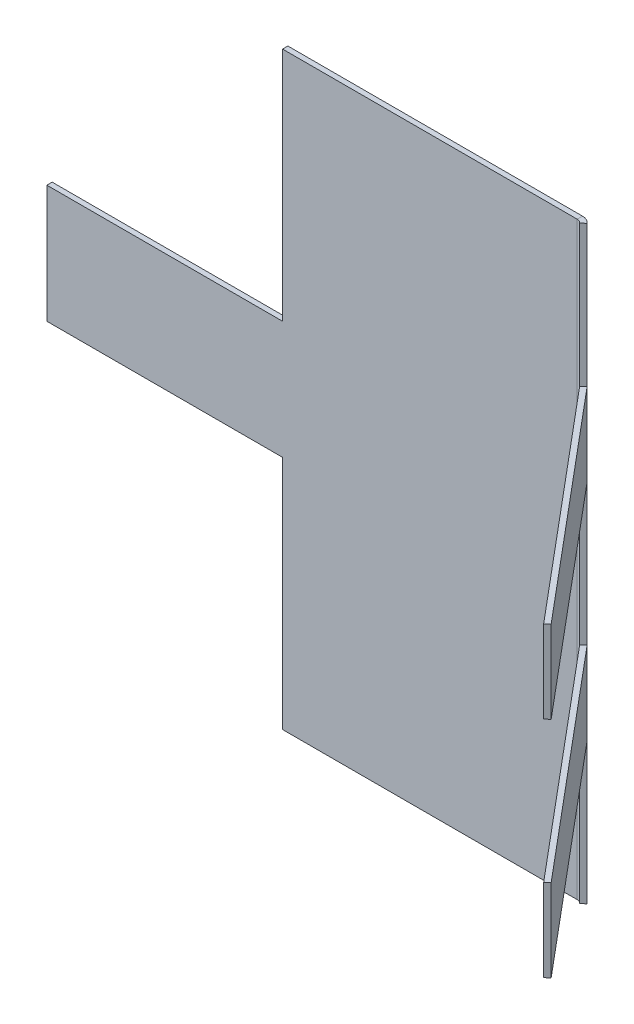
ISO-10303-21;
HEADER;
FILE_DESCRIPTION(('STEP AP214'),'2;1');
FILE_NAME('part.step','',(''),(''),'','','');
FILE_SCHEMA(('AUTOMOTIVE_DESIGN { 1 0 10303 214 1 1 1 1 }'));
ENDSEC;
DATA;
#1=APPLICATION_CONTEXT('core data for automotive mechanical design processes');
#2=APPLICATION_PROTOCOL_DEFINITION('international standard','automotive_design',2000,#1);
#3=PRODUCT_CONTEXT('',#1,'mechanical');
#4=PRODUCT('Part','Part','',(#3));
#5=PRODUCT_RELATED_PRODUCT_CATEGORY('part','',(#4));
#6=PRODUCT_DEFINITION_FORMATION('','',#4);
#7=PRODUCT_DEFINITION_CONTEXT('part definition',#1,'design');
#8=PRODUCT_DEFINITION('design','',#6,#7);
#9=PRODUCT_DEFINITION_SHAPE('','',#8);
#10=(LENGTH_UNIT() NAMED_UNIT(*) SI_UNIT(.MILLI.,.METRE.));
#11=(NAMED_UNIT(*) PLANE_ANGLE_UNIT() SI_UNIT($,.RADIAN.));
#12=(NAMED_UNIT(*) SI_UNIT($,.STERADIAN.) SOLID_ANGLE_UNIT());
#13=UNCERTAINTY_MEASURE_WITH_UNIT(LENGTH_MEASURE(1.E-05),#10,'distance_accuracy_value','');
#14=(GEOMETRIC_REPRESENTATION_CONTEXT(3) GLOBAL_UNCERTAINTY_ASSIGNED_CONTEXT((#13)) GLOBAL_UNIT_ASSIGNED_CONTEXT((#10,
#11,#12)) REPRESENTATION_CONTEXT('',''));
#15=CARTESIAN_POINT('',(0.,0.,0.));
#16=DIRECTION('',(0.,0.,1.));
#17=DIRECTION('',(1.,0.,0.));
#18=AXIS2_PLACEMENT_3D('',#15,#16,#17);
#19=CARTESIAN_POINT('',(-25.,50.,-0.9));
#20=DIRECTION('',(-1.,0.,0.));
#21=DIRECTION('',(0.,-1.,0.));
#22=AXIS2_PLACEMENT_3D('',#19,#20,#21);
#23=PLANE('',#22);
#24=DIRECTION('',(0.,0.,-1.));
#25=VECTOR('',#24,1.);
#26=CARTESIAN_POINT('',(-25.,10.,-0.9));
#27=LINE('',#26,#25);
#28=CARTESIAN_POINT('',(-25.,10.,0.));
#29=VERTEX_POINT('',#28);
#30=CARTESIAN_POINT('',(-25.,10.,-0.9));
#31=VERTEX_POINT('',#30);
#32=EDGE_CURVE('E217',#29,#31,#27,.T.);
#33=ORIENTED_EDGE('',*,*,#32,.F.);
#34=DIRECTION('',(0.,-1.,0.));
#35=VECTOR('',#34,1.);
#36=CARTESIAN_POINT('',(-25.,50.,0.));
#37=LINE('',#36,#35);
#38=CARTESIAN_POINT('',(-25.,50.,0.));
#39=VERTEX_POINT('',#38);
#40=EDGE_CURVE('E310',#39,#29,#37,.T.);
#41=ORIENTED_EDGE('',*,*,#40,.F.);
#42=DIRECTION('',(0.,0.,1.));
#43=VECTOR('',#42,1.);
#44=CARTESIAN_POINT('',(-25.,50.,-0.9));
#45=LINE('',#44,#43);
#46=CARTESIAN_POINT('',(-25.,50.,-0.9));
#47=VERTEX_POINT('',#46);
#48=EDGE_CURVE('E321',#47,#39,#45,.T.);
#49=ORIENTED_EDGE('',*,*,#48,.F.);
#50=DIRECTION('',(0.,-1.,0.));
#51=VECTOR('',#50,1.);
#52=CARTESIAN_POINT('',(-25.,50.,-0.9));
#53=LINE('',#52,#51);
#54=EDGE_CURVE('E297',#47,#31,#53,.T.);
#55=ORIENTED_EDGE('',*,*,#54,.T.);
#56=EDGE_LOOP('',(#33,#41,#49,#55));
#57=FACE_BOUND('',#56,.T.);
#58=ADVANCED_FACE('F59',(#57),#23,.T.);
#59=CARTESIAN_POINT('',(15.8263498777986,0.,-12.8886057613705));
#60=DIRECTION('',(-0.766044443118975,0.,0.642787609686543));
#61=DIRECTION('',(0.642787609686543,0.,0.766044443118975));
#62=AXIS2_PLACEMENT_3D('',#59,#60,#61);
#63=PLANE('',#62);
#64=DIRECTION('',(0.,-1.,0.));
#65=VECTOR('',#64,1.);
#66=CARTESIAN_POINT('',(58.2951281412892,0.,37.7237133072308));
#67=LINE('',#66,#65);
#68=CARTESIAN_POINT('',(58.2951281412893,26.,37.7237133072309));
#69=VERTEX_POINT('',#68);
#70=CARTESIAN_POINT('',(58.2951281412893,12.,37.7237133072309));
#71=VERTEX_POINT('',#70);
#72=EDGE_CURVE('E262',#69,#71,#67,.T.);
#73=ORIENTED_EDGE('',*,*,#72,.T.);
#74=DIRECTION('',(-0.642787609686543,0.,-0.766044443118975));
#75=VECTOR('',#74,1.);
#76=CARTESIAN_POINT('',(15.8263498777986,12.,-12.8886057613705));
#77=LINE('',#76,#75);
#78=CARTESIAN_POINT('',(26.455484441926,12.,-0.221296458404437));
#79=VERTEX_POINT('',#78);
#80=EDGE_CURVE('E244',#71,#79,#77,.T.);
#81=ORIENTED_EDGE('',*,*,#80,.T.);
#82=DIRECTION('',(0.,1.,0.));
#83=VECTOR('',#82,1.);
#84=CARTESIAN_POINT('',(26.4554844419261,-50.,-0.221296458404436));
#85=LINE('',#84,#83);
#86=CARTESIAN_POINT('',(26.4554844419261,26.,-0.221296458404429));
#87=VERTEX_POINT('',#86);
#88=EDGE_CURVE('E274',#87,#79,#85,.F.);
#89=ORIENTED_EDGE('',*,*,#88,.F.);
#90=DIRECTION('',(0.642787609686543,0.,0.766044443118975));
#91=VECTOR('',#90,1.);
#92=CARTESIAN_POINT('',(15.8263498777986,26.,-12.8886057613705));
#93=LINE('',#92,#91);
#94=EDGE_CURVE('E258',#87,#69,#93,.T.);
#95=ORIENTED_EDGE('',*,*,#94,.T.);
#96=EDGE_LOOP('',(#73,#81,#89,#95));
#97=FACE_BOUND('',#96,.T.);
#98=ADVANCED_FACE('F343',(#97),#63,.F.);
#99=CARTESIAN_POINT('',(15.1369098789915,0.,-12.3100969126526));
#100=DIRECTION('',(-0.766044443118975,0.,0.642787609686543));
#101=DIRECTION('',(0.642787609686543,0.,0.766044443118975));
#102=AXIS2_PLACEMENT_3D('',#99,#100,#101);
#103=PLANE('',#102);
#104=DIRECTION('',(-0.642787609686544,0.,-0.766044443118975));
#105=VECTOR('',#104,1.);
#106=CARTESIAN_POINT('',(25.766044443119,12.,0.357212390313439));
#107=LINE('',#106,#105);
#108=CARTESIAN_POINT('',(57.6056881424822,12.,38.3022221559487));
#109=VERTEX_POINT('',#108);
#110=CARTESIAN_POINT('',(25.766044443119,12.,0.357212390313439));
#111=VERTEX_POINT('',#110);
#112=EDGE_CURVE('E233',#109,#111,#107,.T.);
#113=ORIENTED_EDGE('',*,*,#112,.F.);
#114=DIRECTION('',(0.,1.,0.));
#115=VECTOR('',#114,1.);
#116=CARTESIAN_POINT('',(57.6056881424822,-50.,38.3022221559487));
#117=LINE('',#116,#115);
#118=CARTESIAN_POINT('',(57.6056881424822,26.,38.3022221559487));
#119=VERTEX_POINT('',#118);
#120=EDGE_CURVE('E267',#119,#109,#117,.F.);
#121=ORIENTED_EDGE('',*,*,#120,.F.);
#122=DIRECTION('',(0.642787609686543,0.,0.766044443118975));
#123=VECTOR('',#122,1.);
#124=CARTESIAN_POINT('',(25.766044443119,26.,0.357212390313447));
#125=LINE('',#124,#123);
#126=CARTESIAN_POINT('',(25.766044443119,26.,0.357212390313447));
#127=VERTEX_POINT('',#126);
#128=EDGE_CURVE('E253',#127,#119,#125,.T.);
#129=ORIENTED_EDGE('',*,*,#128,.F.);
#130=DIRECTION('',(0.,1.,0.));
#131=VECTOR('',#130,1.);
#132=CARTESIAN_POINT('',(25.766044443119,-50.,0.357212390313453));
#133=LINE('',#132,#131);
#134=EDGE_CURVE('E283',#111,#127,#133,.T.);
#135=ORIENTED_EDGE('',*,*,#134,.F.);
#136=EDGE_LOOP('',(#113,#121,#129,#135));
#137=FACE_BOUND('',#136,.T.);
#138=ADVANCED_FACE('F358',(#137),#103,.T.);
#139=CARTESIAN_POINT('',(58.2951281412893,-50.,37.7237133072308));
#140=DIRECTION('',(-0.642787609686543,0.,-0.766044443118975));
#141=DIRECTION('',(-0.766044443118975,0.,0.642787609686543));
#142=AXIS2_PLACEMENT_3D('',#139,#140,#141);
#143=PLANE('',#142);
#144=ORIENTED_EDGE('',*,*,#120,.T.);
#145=DIRECTION('',(0.766044443118975,0.,-0.642787609686543));
#146=VECTOR('',#145,1.);
#147=CARTESIAN_POINT('',(58.2951281412893,12.,37.7237133072308));
#148=LINE('',#147,#146);
#149=EDGE_CURVE('E67',#109,#71,#148,.T.);
#150=ORIENTED_EDGE('',*,*,#149,.T.);
#151=ORIENTED_EDGE('',*,*,#72,.F.);
#152=DIRECTION('',(-0.766044443118975,0.,0.642787609686543));
#153=VECTOR('',#152,1.);
#154=CARTESIAN_POINT('',(58.2951281412892,26.,37.7237133072308));
#155=LINE('',#154,#153);
#156=EDGE_CURVE('E323',#69,#119,#155,.T.);
#157=ORIENTED_EDGE('',*,*,#156,.T.);
#158=EDGE_LOOP('',(#144,#150,#151,#157));
#159=FACE_BOUND('',#158,.T.);
#160=ADVANCED_FACE('F338',(#159),#143,.F.);
#161=DIRECTION('',(0.,0.,1.));
#162=VECTOR('',#161,1.);
#163=CARTESIAN_POINT('',(-25.,-10.,-0.9));
#164=LINE('',#163,#162);
#165=CARTESIAN_POINT('',(-25.,-10.,-0.9));
#166=VERTEX_POINT('',#165);
#167=CARTESIAN_POINT('',(-25.,-9.99999999999998,0.));
#168=VERTEX_POINT('',#167);
#169=EDGE_CURVE('E214',#166,#168,#164,.T.);
#170=ORIENTED_EDGE('',*,*,#169,.F.);
#171=CARTESIAN_POINT('',(-25.,-50.,-0.9));
#172=VERTEX_POINT('',#171);
#173=EDGE_CURVE('E201',#166,#172,#53,.T.);
#174=ORIENTED_EDGE('',*,*,#173,.T.);
#175=DIRECTION('',(0.,0.,1.));
#176=VECTOR('',#175,1.);
#177=CARTESIAN_POINT('',(-25.,-50.,-0.9));
#178=LINE('',#177,#176);
#179=CARTESIAN_POINT('',(-25.,-50.,0.));
#180=VERTEX_POINT('',#179);
#181=EDGE_CURVE('E309',#172,#180,#178,.T.);
#182=ORIENTED_EDGE('',*,*,#181,.T.);
#183=EDGE_CURVE('E288',#168,#180,#37,.T.);
#184=ORIENTED_EDGE('',*,*,#183,.F.);
#185=EDGE_LOOP('',(#170,#174,#182,#184));
#186=FACE_BOUND('',#185,.T.);
#187=ADVANCED_FACE('F61',(#186),#23,.T.);
#188=CARTESIAN_POINT('',(-25.,50.,-0.9));
#189=DIRECTION('',(0.,1.,0.));
#190=DIRECTION('',(0.,0.,1.));
#191=AXIS2_PLACEMENT_3D('',#188,#189,#190);
#192=PLANE('',#191);
#193=DIRECTION('',(-1.,0.,0.));
#194=VECTOR('',#193,1.);
#195=CARTESIAN_POINT('',(-25.,50.,0.));
#196=LINE('',#195,#194);
#197=CARTESIAN_POINT('',(25.,50.,0.));
#198=VERTEX_POINT('',#197);
#199=EDGE_CURVE('E318',#198,#39,#196,.T.);
#200=ORIENTED_EDGE('',*,*,#199,.F.);
#201=DIRECTION('',(0.,0.,1.));
#202=VECTOR('',#201,1.);
#203=CARTESIAN_POINT('',(25.,50.,-0.9));
#204=LINE('',#203,#202);
#205=CARTESIAN_POINT('',(25.,50.,-0.900000000000005));
#206=VERTEX_POINT('',#205);
#207=EDGE_CURVE('E324',#206,#198,#204,.T.);
#208=ORIENTED_EDGE('',*,*,#207,.F.);
#209=DIRECTION('',(-1.,0.,0.));
#210=VECTOR('',#209,1.);
#211=CARTESIAN_POINT('',(-25.,50.,-0.9));
#212=LINE('',#211,#210);
#213=EDGE_CURVE('E306',#206,#47,#212,.T.);
#214=ORIENTED_EDGE('',*,*,#213,.T.);
#215=ORIENTED_EDGE('',*,*,#48,.T.);
#216=EDGE_LOOP('',(#200,#208,#214,#215));
#217=FACE_BOUND('',#216,.T.);
#218=ADVANCED_FACE('F415',(#217),#192,.T.);
#219=CARTESIAN_POINT('',(-25.,-50.,-0.9));
#220=DIRECTION('',(0.,-1.,0.));
#221=DIRECTION('',(0.,0.,-1.));
#222=AXIS2_PLACEMENT_3D('',#219,#220,#221);
#223=PLANE('',#222);
#224=DIRECTION('',(1.,0.,0.));
#225=VECTOR('',#224,1.);
#226=CARTESIAN_POINT('',(-25.,-50.,0.));
#227=LINE('',#226,#225);
#228=CARTESIAN_POINT('',(25.,-50.,0.));
#229=VERTEX_POINT('',#228);
#230=EDGE_CURVE('E313',#180,#229,#227,.T.);
#231=ORIENTED_EDGE('',*,*,#230,.F.);
#232=ORIENTED_EDGE('',*,*,#181,.F.);
#233=DIRECTION('',(1.,0.,0.));
#234=VECTOR('',#233,1.);
#235=CARTESIAN_POINT('',(-25.,-50.,-0.9));
#236=LINE('',#235,#234);
#237=CARTESIAN_POINT('',(25.,-50.,-0.9));
#238=VERTEX_POINT('',#237);
#239=EDGE_CURVE('E300',#172,#238,#236,.T.);
#240=ORIENTED_EDGE('',*,*,#239,.T.);
#241=DIRECTION('',(0.,0.,1.));
#242=VECTOR('',#241,1.);
#243=CARTESIAN_POINT('',(25.,-50.,-0.9));
#244=LINE('',#243,#242);
#245=EDGE_CURVE('E327',#238,#229,#244,.T.);
#246=ORIENTED_EDGE('',*,*,#245,.T.);
#247=EDGE_LOOP('',(#231,#232,#240,#246));
#248=FACE_BOUND('',#247,.T.);
#249=ADVANCED_FACE('F421',(#248),#223,.T.);
#250=CARTESIAN_POINT('',(0.,0.,-0.9));
#251=DIRECTION('',(0.,0.,1.));
#252=DIRECTION('',(1.,0.,0.));
#253=AXIS2_PLACEMENT_3D('',#250,#251,#252);
#254=PLANE('',#253);
#255=ORIENTED_EDGE('',*,*,#173,.F.);
#256=DIRECTION('',(1.,0.,0.));
#257=VECTOR('',#256,1.);
#258=CARTESIAN_POINT('',(15.,-9.99999999999999,-0.9));
#259=LINE('',#258,#257);
#260=CARTESIAN_POINT('',(-65.,-10.,-0.9));
#261=VERTEX_POINT('',#260);
#262=EDGE_CURVE('E186',#261,#166,#259,.T.);
#263=ORIENTED_EDGE('',*,*,#262,.F.);
#264=DIRECTION('',(0.,-1.,0.));
#265=VECTOR('',#264,1.);
#266=CARTESIAN_POINT('',(-65.,10.,-0.9));
#267=LINE('',#266,#265);
#268=CARTESIAN_POINT('',(-65.,10.,-0.9));
#269=VERTEX_POINT('',#268);
#270=EDGE_CURVE('E199',#269,#261,#267,.T.);
#271=ORIENTED_EDGE('',*,*,#270,.F.);
#272=DIRECTION('',(-1.,0.,0.));
#273=VECTOR('',#272,1.);
#274=CARTESIAN_POINT('',(15.,10.,-0.9));
#275=LINE('',#274,#273);
#276=EDGE_CURVE('E192',#31,#269,#275,.T.);
#277=ORIENTED_EDGE('',*,*,#276,.F.);
#278=ORIENTED_EDGE('',*,*,#54,.F.);
#279=ORIENTED_EDGE('',*,*,#213,.F.);
#280=DIRECTION('',(0.,1.,0.));
#281=VECTOR('',#280,1.);
#282=CARTESIAN_POINT('',(25.,50.,-0.9));
#283=LINE('',#282,#281);
#284=EDGE_CURVE('E303',#238,#206,#283,.T.);
#285=ORIENTED_EDGE('',*,*,#284,.F.);
#286=ORIENTED_EDGE('',*,*,#239,.F.);
#287=EDGE_LOOP('',(#255,#263,#271,#277,#278,#279,#285,#286));
#288=FACE_BOUND('',#287,.T.);
#289=ADVANCED_FACE('F197',(#288),#254,.F.);
#290=CARTESIAN_POINT('',(0.,0.,0.));
#291=DIRECTION('',(0.,0.,1.));
#292=DIRECTION('',(1.,0.,0.));
#293=AXIS2_PLACEMENT_3D('',#290,#291,#292);
#294=PLANE('',#293);
#295=ORIENTED_EDGE('',*,*,#40,.T.);
#296=DIRECTION('',(-1.,0.,0.));
#297=VECTOR('',#296,1.);
#298=CARTESIAN_POINT('',(15.,10.,0.));
#299=LINE('',#298,#297);
#300=CARTESIAN_POINT('',(-65.,10.,0.));
#301=VERTEX_POINT('',#300);
#302=EDGE_CURVE('E206',#29,#301,#299,.T.);
#303=ORIENTED_EDGE('',*,*,#302,.T.);
#304=DIRECTION('',(0.,-1.,0.));
#305=VECTOR('',#304,1.);
#306=CARTESIAN_POINT('',(-65.,10.,0.));
#307=LINE('',#306,#305);
#308=CARTESIAN_POINT('',(-65.,-10.,0.));
#309=VERTEX_POINT('',#308);
#310=EDGE_CURVE('E211',#301,#309,#307,.T.);
#311=ORIENTED_EDGE('',*,*,#310,.T.);
#312=DIRECTION('',(1.,0.,0.));
#313=VECTOR('',#312,1.);
#314=CARTESIAN_POINT('',(15.,-9.99999999999999,0.));
#315=LINE('',#314,#313);
#316=EDGE_CURVE('E74',#309,#168,#315,.T.);
#317=ORIENTED_EDGE('',*,*,#316,.T.);
#318=ORIENTED_EDGE('',*,*,#183,.T.);
#319=ORIENTED_EDGE('',*,*,#230,.T.);
#320=DIRECTION('',(0.,1.,0.));
#321=VECTOR('',#320,1.);
#322=CARTESIAN_POINT('',(25.,50.,0.));
#323=LINE('',#322,#321);
#324=EDGE_CURVE('E316',#229,#198,#323,.T.);
#325=ORIENTED_EDGE('',*,*,#324,.T.);
#326=ORIENTED_EDGE('',*,*,#199,.T.);
#327=EDGE_LOOP('',(#295,#303,#311,#317,#318,#319,#325,#326));
#328=FACE_BOUND('',#327,.T.);
#329=ADVANCED_FACE('F427',(#328),#294,.T.);
#330=CARTESIAN_POINT('',(25.,-50.,0.999999999999989));
#331=DIRECTION('',(0.,-1.,0.));
#332=DIRECTION('',(0.,0.,-1.));
#333=AXIS2_PLACEMENT_3D('',#330,#331,#332);
#334=PLANE('',#333);
#335=DIRECTION('',(-0.766044443118975,0.,0.642787609686543));
#336=VECTOR('',#335,1.);
#337=CARTESIAN_POINT('',(26.4554844419261,-50.,-0.221296458404441));
#338=LINE('',#337,#336);
#339=CARTESIAN_POINT('',(25.766044443119,-50.,0.357212390313439));
#340=VERTEX_POINT('',#339);
#341=CARTESIAN_POINT('',(26.4554844419261,-50.,-0.221296458404438));
#342=VERTEX_POINT('',#341);
#343=EDGE_CURVE('E261',#340,#342,#338,.F.);
#344=ORIENTED_EDGE('',*,*,#343,.F.);
#345=CARTESIAN_POINT('',(25.,-50.,0.999999999999989));
#346=DIRECTION('',(0.,1.,0.));
#347=DIRECTION('',(0.,0.,1.));
#348=AXIS2_PLACEMENT_3D('',#345,#346,#347);
#349=CIRCLE('',#348,0.999999999999993);
#350=EDGE_CURVE('E292',#229,#340,#349,.F.);
#351=ORIENTED_EDGE('',*,*,#350,.F.);
#352=ORIENTED_EDGE('',*,*,#245,.F.);
#353=CARTESIAN_POINT('',(25.,-50.,0.999999999999989));
#354=DIRECTION('',(0.,1.,0.));
#355=DIRECTION('',(0.,0.,1.));
#356=AXIS2_PLACEMENT_3D('',#353,#354,#355);
#357=CIRCLE('',#356,1.89999999999999);
#358=EDGE_CURVE('E285',#238,#342,#357,.F.);
#359=ORIENTED_EDGE('',*,*,#358,.T.);
#360=EDGE_LOOP('',(#344,#351,#352,#359));
#361=FACE_BOUND('',#360,.T.);
#362=ADVANCED_FACE('F381',(#361),#334,.T.);
#363=CARTESIAN_POINT('',(25.,50.,0.999999999999989));
#364=DIRECTION('',(0.,-1.,0.));
#365=DIRECTION('',(0.,0.,-1.));
#366=AXIS2_PLACEMENT_3D('',#363,#364,#365);
#367=PLANE('',#366);
#368=CARTESIAN_POINT('',(25.,50.,0.999999999999989));
#369=DIRECTION('',(0.,1.,0.));
#370=DIRECTION('',(0.,0.,1.));
#371=AXIS2_PLACEMENT_3D('',#368,#369,#370);
#372=CIRCLE('',#371,0.999999999999993);
#373=CARTESIAN_POINT('',(25.766044443119,50.,0.357212390313446));
#374=VERTEX_POINT('',#373);
#375=EDGE_CURVE('E265',#374,#198,#372,.T.);
#376=ORIENTED_EDGE('',*,*,#375,.F.);
#377=DIRECTION('',(-0.766044443118975,0.,0.642787609686543));
#378=VECTOR('',#377,1.);
#379=CARTESIAN_POINT('',(25.766044443119,50.,0.35721239031345));
#380=LINE('',#379,#378);
#381=CARTESIAN_POINT('',(26.4554844419261,50.,-0.221296458404432));
#382=VERTEX_POINT('',#381);
#383=EDGE_CURVE('E276',#374,#382,#380,.F.);
#384=ORIENTED_EDGE('',*,*,#383,.T.);
#385=CARTESIAN_POINT('',(25.,50.,0.999999999999989));
#386=DIRECTION('',(0.,1.,0.));
#387=DIRECTION('',(0.,0.,1.));
#388=AXIS2_PLACEMENT_3D('',#385,#386,#387);
#389=CIRCLE('',#388,1.89999999999999);
#390=EDGE_CURVE('E289',#382,#206,#389,.T.);
#391=ORIENTED_EDGE('',*,*,#390,.T.);
#392=ORIENTED_EDGE('',*,*,#207,.T.);
#393=EDGE_LOOP('',(#376,#384,#391,#392));
#394=FACE_BOUND('',#393,.T.);
#395=ADVANCED_FACE('F372',(#394),#367,.F.);
#396=CARTESIAN_POINT('',(25.,50.,0.999999999999989));
#397=DIRECTION('',(0.,1.,0.));
#398=DIRECTION('',(0.766044443118975,0.,-0.642787609686543));
#399=AXIS2_PLACEMENT_3D('',#396,#397,#398);
#400=CYLINDRICAL_SURFACE('',#399,1.89999999999999);
#401=ORIENTED_EDGE('',*,*,#284,.T.);
#402=ORIENTED_EDGE('',*,*,#390,.F.);
#403=EDGE_CURVE('E271',#382,#87,#85,.F.);
#404=ORIENTED_EDGE('',*,*,#403,.T.);
#405=ORIENTED_EDGE('',*,*,#88,.T.);
#406=DIRECTION('',(0.,-1.,0.));
#407=VECTOR('',#406,1.);
#408=CARTESIAN_POINT('',(26.455484441926,0.,-0.22129645840444));
#409=LINE('',#408,#407);
#410=CARTESIAN_POINT('',(26.4554844419261,-12.,-0.221296458404434));
#411=VERTEX_POINT('',#410);
#412=EDGE_CURVE('E247',#79,#411,#409,.T.);
#413=ORIENTED_EDGE('',*,*,#412,.T.);
#414=CARTESIAN_POINT('',(26.4554844419261,-26.,-0.221296458404438));
#415=VERTEX_POINT('',#414);
#416=EDGE_CURVE('E275',#411,#415,#85,.F.);
#417=ORIENTED_EDGE('',*,*,#416,.T.);
#418=DIRECTION('',(0.,-1.,0.));
#419=VECTOR('',#418,1.);
#420=CARTESIAN_POINT('',(26.455484441926,0.,-0.22129645840444));
#421=LINE('',#420,#419);
#422=EDGE_CURVE('E225',#415,#342,#421,.T.);
#423=ORIENTED_EDGE('',*,*,#422,.T.);
#424=ORIENTED_EDGE('',*,*,#358,.F.);
#425=EDGE_LOOP('',(#401,#402,#404,#405,#413,#417,#423,#424));
#426=FACE_BOUND('',#425,.T.);
#427=ADVANCED_FACE('F369',(#426),#400,.T.);
#428=CARTESIAN_POINT('',(25.,50.,0.999999999999989));
#429=DIRECTION('',(0.,1.,0.));
#430=DIRECTION('',(0.766044443118975,0.,-0.642787609686543));
#431=AXIS2_PLACEMENT_3D('',#428,#429,#430);
#432=CYLINDRICAL_SURFACE('',#431,0.999999999999993);
#433=ORIENTED_EDGE('',*,*,#324,.F.);
#434=ORIENTED_EDGE('',*,*,#350,.T.);
#435=CARTESIAN_POINT('',(25.766044443119,-26.,0.357212390313439));
#436=VERTEX_POINT('',#435);
#437=EDGE_CURVE('E279',#340,#436,#133,.T.);
#438=ORIENTED_EDGE('',*,*,#437,.T.);
#439=CARTESIAN_POINT('',(25.766044443119,-12.,0.357212390313442));
#440=VERTEX_POINT('',#439);
#441=EDGE_CURVE('E282',#436,#440,#133,.T.);
#442=ORIENTED_EDGE('',*,*,#441,.T.);
#443=DIRECTION('',(0.,-1.,0.));
#444=VECTOR('',#443,1.);
#445=CARTESIAN_POINT('',(25.766044443119,12.,0.357212390313439));
#446=LINE('',#445,#444);
#447=EDGE_CURVE('E228',#111,#440,#446,.T.);
#448=ORIENTED_EDGE('',*,*,#447,.F.);
#449=ORIENTED_EDGE('',*,*,#134,.T.);
#450=DIRECTION('',(0.,-1.,0.));
#451=VECTOR('',#450,1.);
#452=CARTESIAN_POINT('',(25.766044443119,50.,0.357212390313446));
#453=LINE('',#452,#451);
#454=EDGE_CURVE('E250',#374,#127,#453,.T.);
#455=ORIENTED_EDGE('',*,*,#454,.F.);
#456=ORIENTED_EDGE('',*,*,#375,.T.);
#457=EDGE_LOOP('',(#433,#434,#438,#442,#448,#449,#455,#456));
#458=FACE_BOUND('',#457,.T.);
#459=ADVANCED_FACE('F375',(#458),#432,.F.);
#460=CARTESIAN_POINT('',(58.2951281412893,-12.,37.7237133072309));
#461=VERTEX_POINT('',#460);
#462=CARTESIAN_POINT('',(58.2951281412893,-26.,37.7237133072308));
#463=VERTEX_POINT('',#462);
#464=EDGE_CURVE('E266',#461,#463,#67,.T.);
#465=ORIENTED_EDGE('',*,*,#464,.T.);
#466=DIRECTION('',(-0.642787609686543,0.,-0.766044443118975));
#467=VECTOR('',#466,1.);
#468=CARTESIAN_POINT('',(15.8263498777986,-26.,-12.8886057613705));
#469=LINE('',#468,#467);
#470=EDGE_CURVE('E82',#463,#415,#469,.T.);
#471=ORIENTED_EDGE('',*,*,#470,.T.);
#472=ORIENTED_EDGE('',*,*,#416,.F.);
#473=DIRECTION('',(0.642787609686543,0.,0.766044443118975));
#474=VECTOR('',#473,1.);
#475=CARTESIAN_POINT('',(15.8263498777986,-12.,-12.8886057613705));
#476=LINE('',#475,#474);
#477=EDGE_CURVE('E239',#411,#461,#476,.T.);
#478=ORIENTED_EDGE('',*,*,#477,.T.);
#479=EDGE_LOOP('',(#465,#471,#472,#478));
#480=FACE_BOUND('',#479,.T.);
#481=ADVANCED_FACE('F392',(#480),#63,.F.);
#482=DIRECTION('',(-0.642787609686544,0.,-0.766044443118974));
#483=VECTOR('',#482,1.);
#484=CARTESIAN_POINT('',(57.6056881424822,-26.,38.3022221559487));
#485=LINE('',#484,#483);
#486=CARTESIAN_POINT('',(57.6056881424822,-26.,38.3022221559487));
#487=VERTEX_POINT('',#486);
#488=EDGE_CURVE('E219',#487,#436,#485,.T.);
#489=ORIENTED_EDGE('',*,*,#488,.F.);
#490=CARTESIAN_POINT('',(57.6056881424822,-12.,38.3022221559487));
#491=VERTEX_POINT('',#490);
#492=EDGE_CURVE('E270',#491,#487,#117,.F.);
#493=ORIENTED_EDGE('',*,*,#492,.F.);
#494=DIRECTION('',(0.642787609686544,0.,0.766044443118974));
#495=VECTOR('',#494,1.);
#496=CARTESIAN_POINT('',(25.766044443119,-12.,0.357212390313442));
#497=LINE('',#496,#495);
#498=EDGE_CURVE('E231',#440,#491,#497,.T.);
#499=ORIENTED_EDGE('',*,*,#498,.F.);
#500=ORIENTED_EDGE('',*,*,#441,.F.);
#501=EDGE_LOOP('',(#489,#493,#499,#500));
#502=FACE_BOUND('',#501,.T.);
#503=ADVANCED_FACE('F398',(#502),#103,.T.);
#504=ORIENTED_EDGE('',*,*,#492,.T.);
#505=DIRECTION('',(0.766044443118975,0.,-0.642787609686543));
#506=VECTOR('',#505,1.);
#507=CARTESIAN_POINT('',(58.2951281412893,-26.,37.7237133072308));
#508=LINE('',#507,#506);
#509=EDGE_CURVE('E13',#487,#463,#508,.T.);
#510=ORIENTED_EDGE('',*,*,#509,.T.);
#511=ORIENTED_EDGE('',*,*,#464,.F.);
#512=DIRECTION('',(-0.766044443118975,0.,0.642787609686543));
#513=VECTOR('',#512,1.);
#514=CARTESIAN_POINT('',(58.2951281412893,-12.,37.7237133072308));
#515=LINE('',#514,#513);
#516=EDGE_CURVE('E333',#461,#491,#515,.T.);
#517=ORIENTED_EDGE('',*,*,#516,.T.);
#518=EDGE_LOOP('',(#504,#510,#511,#517));
#519=FACE_BOUND('',#518,.T.);
#520=ADVANCED_FACE('F395',(#519),#143,.F.);
#521=CARTESIAN_POINT('',(33.4264888743087,50.,-6.07066370655199));
#522=DIRECTION('',(-0.642787609686544,0.,-0.766044443118974));
#523=DIRECTION('',(-0.766044443118974,0.,0.642787609686544));
#524=AXIS2_PLACEMENT_3D('',#521,#522,#523);
#525=PLANE('',#524);
#526=ORIENTED_EDGE('',*,*,#383,.F.);
#527=ORIENTED_EDGE('',*,*,#454,.T.);
#528=DIRECTION('',(-0.766044443118974,0.,0.642787609686544));
#529=VECTOR('',#528,1.);
#530=CARTESIAN_POINT('',(33.4264888743087,26.,-6.07066370655199));
#531=LINE('',#530,#529);
#532=EDGE_CURVE('E255',#87,#127,#531,.T.);
#533=ORIENTED_EDGE('',*,*,#532,.F.);
#534=ORIENTED_EDGE('',*,*,#403,.F.);
#535=EDGE_LOOP('',(#526,#527,#533,#534));
#536=FACE_BOUND('',#535,.T.);
#537=ADVANCED_FACE('F350',(#536),#525,.F.);
#538=CARTESIAN_POINT('',(33.4264888743087,26.,-6.07066370655199));
#539=DIRECTION('',(0.,-1.,0.));
#540=DIRECTION('',(1.,0.,0.));
#541=AXIS2_PLACEMENT_3D('',#538,#539,#540);
#542=PLANE('',#541);
#543=ORIENTED_EDGE('',*,*,#532,.T.);
#544=ORIENTED_EDGE('',*,*,#128,.T.);
#545=ORIENTED_EDGE('',*,*,#156,.F.);
#546=ORIENTED_EDGE('',*,*,#94,.F.);
#547=EDGE_LOOP('',(#543,#544,#545,#546));
#548=FACE_BOUND('',#547,.T.);
#549=ADVANCED_FACE('F348',(#548),#542,.F.);
#550=CARTESIAN_POINT('',(33.4264888743087,12.,-6.070663706552));
#551=DIRECTION('',(-0.642787609686544,0.,-0.766044443118974));
#552=DIRECTION('',(-0.766044443118974,0.,0.642787609686544));
#553=AXIS2_PLACEMENT_3D('',#550,#551,#552);
#554=PLANE('',#553);
#555=DIRECTION('',(-0.766044443118974,0.,0.642787609686544));
#556=VECTOR('',#555,1.);
#557=CARTESIAN_POINT('',(33.4264888743087,12.,-6.070663706552));
#558=LINE('',#557,#556);
#559=EDGE_CURVE('E237',#79,#111,#558,.T.);
#560=ORIENTED_EDGE('',*,*,#559,.T.);
#561=ORIENTED_EDGE('',*,*,#447,.T.);
#562=DIRECTION('',(-0.766044443118974,0.,0.642787609686544));
#563=VECTOR('',#562,1.);
#564=CARTESIAN_POINT('',(33.4264888743087,-12.,-6.070663706552));
#565=LINE('',#564,#563);
#566=EDGE_CURVE('E236',#411,#440,#565,.T.);
#567=ORIENTED_EDGE('',*,*,#566,.F.);
#568=ORIENTED_EDGE('',*,*,#412,.F.);
#569=EDGE_LOOP('',(#560,#561,#567,#568));
#570=FACE_BOUND('',#569,.T.);
#571=ADVANCED_FACE('F363',(#570),#554,.F.);
#572=CARTESIAN_POINT('',(33.4264888743087,12.,-6.070663706552));
#573=DIRECTION('',(0.,1.,0.));
#574=DIRECTION('',(-1.,0.,0.));
#575=AXIS2_PLACEMENT_3D('',#572,#573,#574);
#576=PLANE('',#575);
#577=ORIENTED_EDGE('',*,*,#149,.F.);
#578=ORIENTED_EDGE('',*,*,#112,.T.);
#579=ORIENTED_EDGE('',*,*,#559,.F.);
#580=ORIENTED_EDGE('',*,*,#80,.F.);
#581=EDGE_LOOP('',(#577,#578,#579,#580));
#582=FACE_BOUND('',#581,.T.);
#583=ADVANCED_FACE('F361',(#582),#576,.F.);
#584=CARTESIAN_POINT('',(33.4264888743087,-12.,-6.070663706552));
#585=DIRECTION('',(0.,-1.,0.));
#586=DIRECTION('',(1.,0.,0.));
#587=AXIS2_PLACEMENT_3D('',#584,#585,#586);
#588=PLANE('',#587);
#589=ORIENTED_EDGE('',*,*,#566,.T.);
#590=ORIENTED_EDGE('',*,*,#498,.T.);
#591=ORIENTED_EDGE('',*,*,#516,.F.);
#592=ORIENTED_EDGE('',*,*,#477,.F.);
#593=EDGE_LOOP('',(#589,#590,#591,#592));
#594=FACE_BOUND('',#593,.T.);
#595=ADVANCED_FACE('F388',(#594),#588,.F.);
#596=CARTESIAN_POINT('',(33.4264888743087,-50.,-6.070663706552));
#597=DIRECTION('',(-0.642787609686544,0.,-0.766044443118974));
#598=DIRECTION('',(-0.766044443118974,0.,0.642787609686544));
#599=AXIS2_PLACEMENT_3D('',#596,#597,#598);
#600=PLANE('',#599);
#601=DIRECTION('',(-0.766044443118974,0.,0.642787609686544));
#602=VECTOR('',#601,1.);
#603=CARTESIAN_POINT('',(33.4264888743087,-26.,-6.070663706552));
#604=LINE('',#603,#602);
#605=EDGE_CURVE('E222',#415,#436,#604,.T.);
#606=ORIENTED_EDGE('',*,*,#605,.T.);
#607=ORIENTED_EDGE('',*,*,#437,.F.);
#608=ORIENTED_EDGE('',*,*,#343,.T.);
#609=ORIENTED_EDGE('',*,*,#422,.F.);
#610=EDGE_LOOP('',(#606,#607,#608,#609));
#611=FACE_BOUND('',#610,.T.);
#612=ADVANCED_FACE('F383',(#611),#600,.F.);
#613=CARTESIAN_POINT('',(65.266132573672,-26.,31.8743460590833));
#614=DIRECTION('',(0.,1.,0.));
#615=DIRECTION('',(-1.,0.,0.));
#616=AXIS2_PLACEMENT_3D('',#613,#614,#615);
#617=PLANE('',#616);
#618=ORIENTED_EDGE('',*,*,#509,.F.);
#619=ORIENTED_EDGE('',*,*,#488,.T.);
#620=ORIENTED_EDGE('',*,*,#605,.F.);
#621=ORIENTED_EDGE('',*,*,#470,.F.);
#622=EDGE_LOOP('',(#618,#619,#620,#621));
#623=FACE_BOUND('',#622,.T.);
#624=ADVANCED_FACE('F397',(#623),#617,.F.);
#625=CARTESIAN_POINT('',(-65.,10.,-0.9));
#626=DIRECTION('',(-1.,0.,0.));
#627=DIRECTION('',(0.,0.,1.));
#628=AXIS2_PLACEMENT_3D('',#625,#626,#627);
#629=PLANE('',#628);
#630=ORIENTED_EDGE('',*,*,#310,.F.);
#631=DIRECTION('',(0.,0.,1.));
#632=VECTOR('',#631,1.);
#633=CARTESIAN_POINT('',(-65.,10.,-0.9));
#634=LINE('',#633,#632);
#635=EDGE_CURVE('E191',#269,#301,#634,.T.);
#636=ORIENTED_EDGE('',*,*,#635,.F.);
#637=ORIENTED_EDGE('',*,*,#270,.T.);
#638=DIRECTION('',(0.,0.,1.));
#639=VECTOR('',#638,1.);
#640=CARTESIAN_POINT('',(-65.,-10.,-0.9));
#641=LINE('',#640,#639);
#642=EDGE_CURVE('E183',#261,#309,#641,.T.);
#643=ORIENTED_EDGE('',*,*,#642,.T.);
#644=EDGE_LOOP('',(#630,#636,#637,#643));
#645=FACE_BOUND('',#644,.T.);
#646=ADVANCED_FACE('F204',(#645),#629,.T.);
#647=CARTESIAN_POINT('',(15.,10.,-0.9));
#648=DIRECTION('',(0.,1.,0.));
#649=DIRECTION('',(-1.,0.,0.));
#650=AXIS2_PLACEMENT_3D('',#647,#648,#649);
#651=PLANE('',#650);
#652=ORIENTED_EDGE('',*,*,#302,.F.);
#653=ORIENTED_EDGE('',*,*,#32,.T.);
#654=ORIENTED_EDGE('',*,*,#276,.T.);
#655=ORIENTED_EDGE('',*,*,#635,.T.);
#656=EDGE_LOOP('',(#652,#653,#654,#655));
#657=FACE_BOUND('',#656,.T.);
#658=ADVANCED_FACE('F432',(#657),#651,.T.);
#659=CARTESIAN_POINT('',(15.,-9.99999999999999,-0.9));
#660=DIRECTION('',(0.,-1.,0.));
#661=DIRECTION('',(1.,0.,0.));
#662=AXIS2_PLACEMENT_3D('',#659,#660,#661);
#663=PLANE('',#662);
#664=ORIENTED_EDGE('',*,*,#262,.T.);
#665=ORIENTED_EDGE('',*,*,#169,.T.);
#666=ORIENTED_EDGE('',*,*,#316,.F.);
#667=ORIENTED_EDGE('',*,*,#642,.F.);
#668=EDGE_LOOP('',(#664,#665,#666,#667));
#669=FACE_BOUND('',#668,.T.);
#670=ADVANCED_FACE('F185',(#669),#663,.T.);
#671=CLOSED_SHELL('',(#58,#98,#138,#160,#187,#218,#249,#289,#329,#362,#395,#427,#459,#481,#503,
#520,#537,#549,#571,#583,#595,#612,#624,#646,#658,#670));
#672=MANIFOLD_SOLID_BREP('B2',#671);
#673=ADVANCED_BREP_SHAPE_REPRESENTATION('',(#18,#672),#14);
#674=SHAPE_DEFINITION_REPRESENTATION(#9,#673);
ENDSEC;
END-ISO-10303-21;
